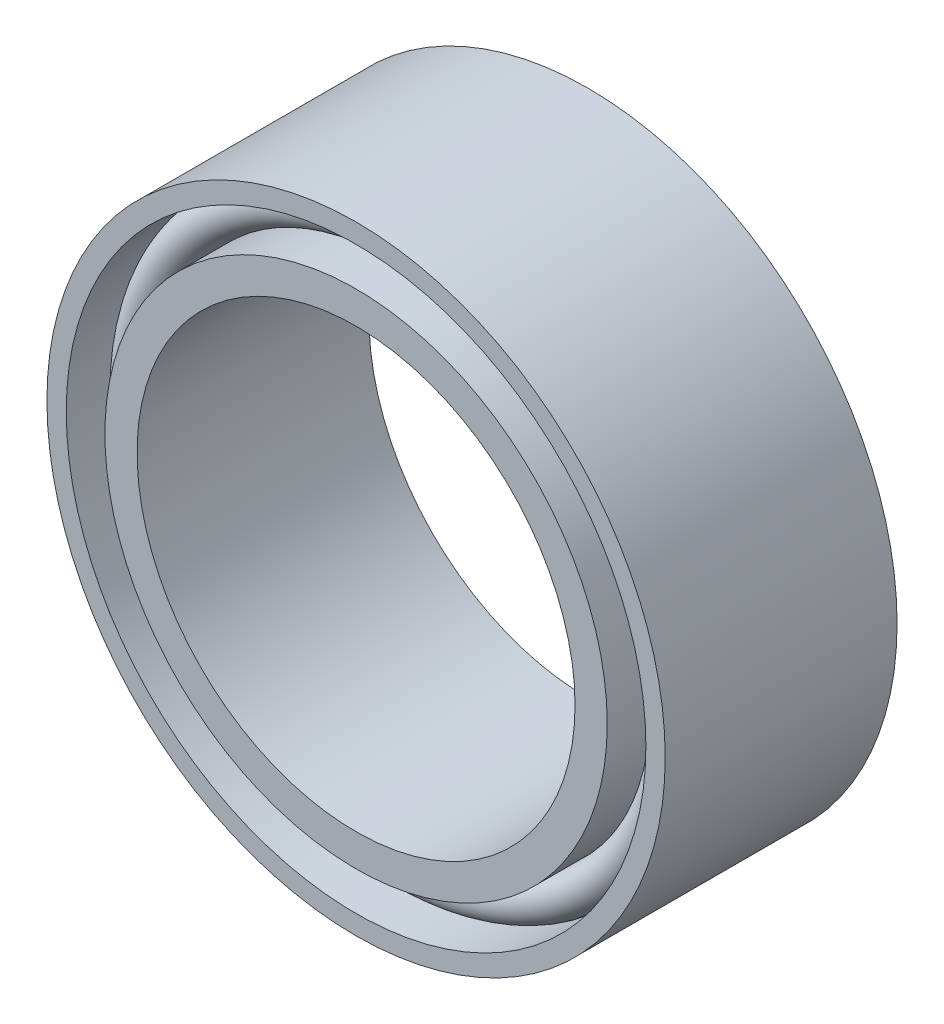
ISO-10303-21;
HEADER;
FILE_DESCRIPTION(('STEP AP214'),'2;1');
FILE_NAME('part.step','',(''),(''),'','','');
FILE_SCHEMA(('AUTOMOTIVE_DESIGN { 1 0 10303 214 1 1 1 1 }'));
ENDSEC;
DATA;
#1=APPLICATION_CONTEXT('core data for automotive mechanical design processes');
#2=APPLICATION_PROTOCOL_DEFINITION('international standard','automotive_design',2000,#1);
#3=PRODUCT_CONTEXT('',#1,'mechanical');
#4=PRODUCT('Part','Part','',(#3));
#5=PRODUCT_RELATED_PRODUCT_CATEGORY('part','',(#4));
#6=PRODUCT_DEFINITION_FORMATION('','',#4);
#7=PRODUCT_DEFINITION_CONTEXT('part definition',#1,'design');
#8=PRODUCT_DEFINITION('design','',#6,#7);
#9=PRODUCT_DEFINITION_SHAPE('','',#8);
#10=(LENGTH_UNIT() NAMED_UNIT(*) SI_UNIT(.MILLI.,.METRE.));
#11=(NAMED_UNIT(*) PLANE_ANGLE_UNIT() SI_UNIT($,.RADIAN.));
#12=(NAMED_UNIT(*) SI_UNIT($,.STERADIAN.) SOLID_ANGLE_UNIT());
#13=UNCERTAINTY_MEASURE_WITH_UNIT(LENGTH_MEASURE(1.E-05),#10,'distance_accuracy_value','');
#14=(GEOMETRIC_REPRESENTATION_CONTEXT(3) GLOBAL_UNCERTAINTY_ASSIGNED_CONTEXT((#13)) GLOBAL_UNIT_ASSIGNED_CONTEXT((#10,
#11,#12)) REPRESENTATION_CONTEXT('',''));
#15=CARTESIAN_POINT('',(0.,0.,0.));
#16=DIRECTION('',(0.,0.,1.));
#17=DIRECTION('',(1.,0.,0.));
#18=AXIS2_PLACEMENT_3D('',#15,#16,#17);
#19=CARTESIAN_POINT('',(0.,0.,0.));
#20=DIRECTION('',(0.,0.,1.));
#21=DIRECTION('',(1.,0.,0.));
#22=AXIS2_PLACEMENT_3D('',#19,#20,#21);
#23=CYLINDRICAL_SURFACE('',#22,19.5);
#24=CARTESIAN_POINT('',(0.,0.,0.));
#25=DIRECTION('',(0.,0.,1.));
#26=DIRECTION('',(1.,0.,0.));
#27=AXIS2_PLACEMENT_3D('',#24,#25,#26);
#28=CIRCLE('',#27,19.5);
#29=CARTESIAN_POINT('',(19.5,0.,0.));
#30=VERTEX_POINT('',#29);
#31=EDGE_CURVE('E13',#30,#30,#28,.T.);
#32=ORIENTED_EDGE('',*,*,#31,.T.);
#33=EDGE_LOOP('',(#32));
#34=FACE_BOUND('',#33,.T.);
#35=CARTESIAN_POINT('',(0.,0.,18.));
#36=DIRECTION('',(0.,0.,1.));
#37=DIRECTION('',(1.,0.,0.));
#38=AXIS2_PLACEMENT_3D('',#35,#36,#37);
#39=CIRCLE('',#38,19.5);
#40=CARTESIAN_POINT('',(19.5,0.,18.));
#41=VERTEX_POINT('',#40);
#42=EDGE_CURVE('E55',#41,#41,#39,.T.);
#43=ORIENTED_EDGE('',*,*,#42,.F.);
#44=EDGE_LOOP('',(#43));
#45=FACE_BOUND('',#44,.T.);
#46=ADVANCED_FACE('F52',(#34,#45),#23,.T.);
#47=CARTESIAN_POINT('',(0.,0.,0.));
#48=DIRECTION('',(0.,0.,1.));
#49=DIRECTION('',(1.,0.,0.));
#50=AXIS2_PLACEMENT_3D('',#47,#48,#49);
#51=PLANE('',#50);
#52=CARTESIAN_POINT('',(0.,0.,0.));
#53=DIRECTION('',(0.,0.,1.));
#54=DIRECTION('',(1.,0.,0.));
#55=AXIS2_PLACEMENT_3D('',#52,#53,#54);
#56=CIRCLE('',#55,17.);
#57=CARTESIAN_POINT('',(17.,0.,0.));
#58=VERTEX_POINT('',#57);
#59=EDGE_CURVE('E62',#58,#58,#56,.T.);
#60=ORIENTED_EDGE('',*,*,#59,.T.);
#61=EDGE_LOOP('',(#60));
#62=FACE_BOUND('',#61,.T.);
#63=ORIENTED_EDGE('',*,*,#31,.F.);
#64=EDGE_LOOP('',(#63));
#65=FACE_BOUND('',#64,.T.);
#66=ADVANCED_FACE('F70',(#62,#65),#51,.F.);
#67=CARTESIAN_POINT('',(0.,0.,18.));
#68=DIRECTION('',(0.,0.,1.));
#69=DIRECTION('',(1.,0.,0.));
#70=AXIS2_PLACEMENT_3D('',#67,#68,#69);
#71=PLANE('',#70);
#72=CARTESIAN_POINT('',(0.,0.,18.));
#73=DIRECTION('',(0.,0.,1.));
#74=DIRECTION('',(1.,0.,0.));
#75=AXIS2_PLACEMENT_3D('',#72,#73,#74);
#76=CIRCLE('',#75,17.);
#77=CARTESIAN_POINT('',(17.,0.,18.));
#78=VERTEX_POINT('',#77);
#79=EDGE_CURVE('E64',#78,#78,#76,.T.);
#80=ORIENTED_EDGE('',*,*,#79,.F.);
#81=EDGE_LOOP('',(#80));
#82=FACE_BOUND('',#81,.T.);
#83=ORIENTED_EDGE('',*,*,#42,.T.);
#84=EDGE_LOOP('',(#83));
#85=FACE_BOUND('',#84,.T.);
#86=ADVANCED_FACE('F76',(#82,#85),#71,.T.);
#87=CARTESIAN_POINT('',(0.,0.,0.));
#88=DIRECTION('',(0.,0.,1.));
#89=DIRECTION('',(1.,0.,0.));
#90=AXIS2_PLACEMENT_3D('',#87,#88,#89);
#91=CYLINDRICAL_SURFACE('',#90,17.);
#92=ORIENTED_EDGE('',*,*,#59,.F.);
#93=EDGE_LOOP('',(#92));
#94=FACE_BOUND('',#93,.T.);
#95=ORIENTED_EDGE('',*,*,#79,.T.);
#96=EDGE_LOOP('',(#95));
#97=FACE_BOUND('',#96,.T.);
#98=ADVANCED_FACE('F73',(#94,#97),#91,.F.);
#99=CLOSED_SHELL('',(#46,#66,#86,#98));
#100=MANIFOLD_SOLID_BREP('B2',#99);
#101=CARTESIAN_POINT('',(0.,0.,18.));
#102=DIRECTION('',(0.,0.,-1.));
#103=DIRECTION('',(-1.,0.,0.));
#104=AXIS2_PLACEMENT_3D('',#101,#102,#103);
#105=CYLINDRICAL_SURFACE('',#104,22.5);
#106=CARTESIAN_POINT('',(0.,0.,0.));
#107=DIRECTION('',(0.,0.,1.));
#108=DIRECTION('',(1.,0.,0.));
#109=AXIS2_PLACEMENT_3D('',#106,#107,#108);
#110=CIRCLE('',#109,22.5);
#111=CARTESIAN_POINT('',(22.5,0.,0.));
#112=VERTEX_POINT('',#111);
#113=EDGE_CURVE('E137',#112,#112,#110,.T.);
#114=ORIENTED_EDGE('',*,*,#113,.F.);
#115=EDGE_LOOP('',(#114));
#116=FACE_BOUND('',#115,.T.);
#117=CARTESIAN_POINT('',(0.,0.,4.));
#118=DIRECTION('',(0.,0.,-1.));
#119=DIRECTION('',(-1.,0.,0.));
#120=AXIS2_PLACEMENT_3D('',#117,#118,#119);
#121=CIRCLE('',#120,22.5);
#122=CARTESIAN_POINT('',(-22.5,0.,4.));
#123=VERTEX_POINT('',#122);
#124=EDGE_CURVE('E148',#123,#123,#121,.T.);
#125=ORIENTED_EDGE('',*,*,#124,.F.);
#126=EDGE_LOOP('',(#125));
#127=FACE_BOUND('',#126,.T.);
#128=ADVANCED_FACE('F119',(#116,#127),#105,.F.);
#129=CARTESIAN_POINT('',(0.,0.,18.));
#130=DIRECTION('',(0.,0.,1.));
#131=DIRECTION('',(1.,0.,0.));
#132=AXIS2_PLACEMENT_3D('',#129,#130,#131);
#133=PLANE('',#132);
#134=CARTESIAN_POINT('',(0.,0.,18.));
#135=DIRECTION('',(0.,0.,1.));
#136=DIRECTION('',(1.,0.,0.));
#137=AXIS2_PLACEMENT_3D('',#134,#135,#136);
#138=CIRCLE('',#137,24.);
#139=CARTESIAN_POINT('',(24.,0.,18.));
#140=VERTEX_POINT('',#139);
#141=EDGE_CURVE('E126',#140,#140,#138,.T.);
#142=ORIENTED_EDGE('',*,*,#141,.T.);
#143=EDGE_LOOP('',(#142));
#144=FACE_BOUND('',#143,.T.);
#145=CARTESIAN_POINT('',(0.,0.,18.));
#146=DIRECTION('',(0.,0.,1.));
#147=DIRECTION('',(1.,0.,0.));
#148=AXIS2_PLACEMENT_3D('',#145,#146,#147);
#149=CIRCLE('',#148,22.5);
#150=CARTESIAN_POINT('',(22.5,0.,18.));
#151=VERTEX_POINT('',#150);
#152=EDGE_CURVE('E135',#151,#151,#149,.T.);
#153=ORIENTED_EDGE('',*,*,#152,.F.);
#154=EDGE_LOOP('',(#153));
#155=FACE_BOUND('',#154,.T.);
#156=ADVANCED_FACE('F156',(#144,#155),#133,.T.);
#157=CARTESIAN_POINT('',(0.,0.,0.));
#158=DIRECTION('',(0.,0.,1.));
#159=DIRECTION('',(1.,0.,0.));
#160=AXIS2_PLACEMENT_3D('',#157,#158,#159);
#161=PLANE('',#160);
#162=CARTESIAN_POINT('',(0.,0.,0.));
#163=DIRECTION('',(0.,0.,1.));
#164=DIRECTION('',(1.,0.,0.));
#165=AXIS2_PLACEMENT_3D('',#162,#163,#164);
#166=CIRCLE('',#165,24.);
#167=CARTESIAN_POINT('',(24.,0.,0.));
#168=VERTEX_POINT('',#167);
#169=EDGE_CURVE('E130',#168,#168,#166,.T.);
#170=ORIENTED_EDGE('',*,*,#169,.F.);
#171=EDGE_LOOP('',(#170));
#172=FACE_BOUND('',#171,.T.);
#173=ORIENTED_EDGE('',*,*,#113,.T.);
#174=EDGE_LOOP('',(#173));
#175=FACE_BOUND('',#174,.T.);
#176=ADVANCED_FACE('F163',(#172,#175),#161,.F.);
#177=CARTESIAN_POINT('',(0.,0.,18.));
#178=DIRECTION('',(0.,0.,-1.));
#179=DIRECTION('',(-1.,0.,0.));
#180=AXIS2_PLACEMENT_3D('',#177,#178,#179);
#181=CYLINDRICAL_SURFACE('',#180,24.);
#182=ORIENTED_EDGE('',*,*,#141,.F.);
#183=EDGE_LOOP('',(#182));
#184=FACE_BOUND('',#183,.T.);
#185=ORIENTED_EDGE('',*,*,#169,.T.);
#186=EDGE_LOOP('',(#185));
#187=FACE_BOUND('',#186,.T.);
#188=ADVANCED_FACE('F121',(#184,#187),#181,.T.);
#189=CARTESIAN_POINT('',(0.,0.,14.));
#190=DIRECTION('',(0.,0.,-1.));
#191=DIRECTION('',(-1.,0.,0.));
#192=AXIS2_PLACEMENT_3D('',#189,#190,#191);
#193=CIRCLE('',#192,22.5);
#194=CARTESIAN_POINT('',(-22.5,0.,14.));
#195=VERTEX_POINT('',#194);
#196=EDGE_CURVE('E51',#195,#195,#193,.F.);
#197=ORIENTED_EDGE('',*,*,#196,.F.);
#198=EDGE_LOOP('',(#197));
#199=FACE_BOUND('',#198,.T.);
#200=ORIENTED_EDGE('',*,*,#152,.T.);
#201=EDGE_LOOP('',(#200));
#202=FACE_BOUND('',#201,.T.);
#203=ADVANCED_FACE('F159',(#199,#202),#105,.F.);
#204=CARTESIAN_POINT('',(0.,0.,14.));
#205=DIRECTION('',(0.,0.,-1.));
#206=DIRECTION('',(-1.,0.,0.));
#207=AXIS2_PLACEMENT_3D('',#204,#205,#206);
#208=TOROIDAL_SURFACE('',#207,21.,1.5);
#209=CARTESIAN_POINT('',(0.,0.,14.));
#210=DIRECTION('',(0.,0.,-1.));
#211=DIRECTION('',(-1.,0.,0.));
#212=AXIS2_PLACEMENT_3D('',#209,#210,#211);
#213=CIRCLE('',#212,19.5);
#214=CARTESIAN_POINT('',(-19.5,0.,14.));
#215=VERTEX_POINT('',#214);
#216=EDGE_CURVE('E140',#215,#215,#213,.T.);
#217=ORIENTED_EDGE('',*,*,#216,.T.);
#218=EDGE_LOOP('',(#217));
#219=FACE_BOUND('',#218,.T.);
#220=ORIENTED_EDGE('',*,*,#196,.T.);
#221=EDGE_LOOP('',(#220));
#222=FACE_BOUND('',#221,.T.);
#223=ADVANCED_FACE('F168',(#219,#222),#208,.T.);
#224=CARTESIAN_POINT('',(0.,0.,0.));
#225=DIRECTION('',(0.,0.,-1.));
#226=DIRECTION('',(-1.,0.,0.));
#227=AXIS2_PLACEMENT_3D('',#224,#225,#226);
#228=CYLINDRICAL_SURFACE('',#227,19.5);
#229=CARTESIAN_POINT('',(0.,0.,4.));
#230=DIRECTION('',(0.,0.,-1.));
#231=DIRECTION('',(-1.,0.,0.));
#232=AXIS2_PLACEMENT_3D('',#229,#230,#231);
#233=CIRCLE('',#232,19.5);
#234=CARTESIAN_POINT('',(-19.5,0.,4.));
#235=VERTEX_POINT('',#234);
#236=EDGE_CURVE('E145',#235,#235,#233,.T.);
#237=ORIENTED_EDGE('',*,*,#236,.T.);
#238=EDGE_LOOP('',(#237));
#239=FACE_BOUND('',#238,.T.);
#240=ORIENTED_EDGE('',*,*,#216,.F.);
#241=EDGE_LOOP('',(#240));
#242=FACE_BOUND('',#241,.T.);
#243=ADVANCED_FACE('F174',(#239,#242),#228,.F.);
#244=CARTESIAN_POINT('',(0.,0.,4.));
#245=DIRECTION('',(0.,0.,-1.));
#246=DIRECTION('',(-1.,0.,0.));
#247=AXIS2_PLACEMENT_3D('',#244,#245,#246);
#248=TOROIDAL_SURFACE('',#247,21.,1.5);
#249=ORIENTED_EDGE('',*,*,#124,.T.);
#250=EDGE_LOOP('',(#249));
#251=FACE_BOUND('',#250,.T.);
#252=ORIENTED_EDGE('',*,*,#236,.F.);
#253=EDGE_LOOP('',(#252));
#254=FACE_BOUND('',#253,.T.);
#255=ADVANCED_FACE('F152',(#251,#254),#248,.T.);
#256=CLOSED_SHELL('',(#128,#156,#176,#188,#203,#223,#243,#255));
#257=MANIFOLD_SOLID_BREP('B8',#256);
#258=ADVANCED_BREP_SHAPE_REPRESENTATION('',(#18,#100,#257),#14);
#259=SHAPE_DEFINITION_REPRESENTATION(#9,#258);
ENDSEC;
END-ISO-10303-21;
